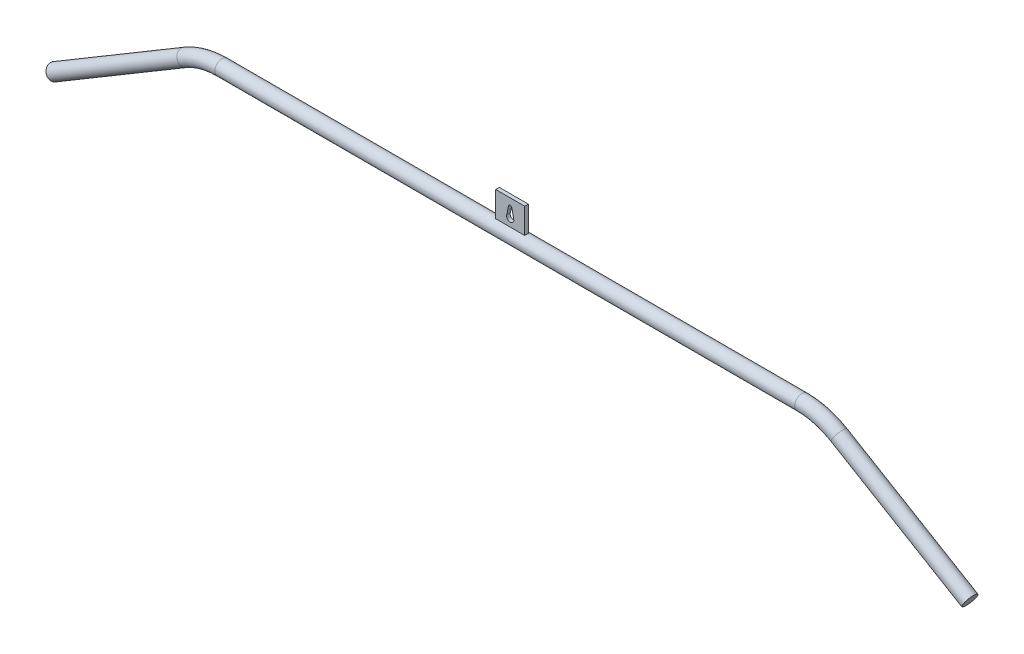
ISO-10303-21;
HEADER;
FILE_DESCRIPTION(('STEP AP214'),'2;1');
FILE_NAME('part.step','',(''),(''),'','','');
FILE_SCHEMA(('AUTOMOTIVE_DESIGN { 1 0 10303 214 1 1 1 1 }'));
ENDSEC;
DATA;
#1=APPLICATION_CONTEXT('core data for automotive mechanical design processes');
#2=APPLICATION_PROTOCOL_DEFINITION('international standard','automotive_design',2000,#1);
#3=PRODUCT_CONTEXT('',#1,'mechanical');
#4=PRODUCT('Part','Part','',(#3));
#5=PRODUCT_RELATED_PRODUCT_CATEGORY('part','',(#4));
#6=PRODUCT_DEFINITION_FORMATION('','',#4);
#7=PRODUCT_DEFINITION_CONTEXT('part definition',#1,'design');
#8=PRODUCT_DEFINITION('design','',#6,#7);
#9=PRODUCT_DEFINITION_SHAPE('','',#8);
#10=(LENGTH_UNIT() NAMED_UNIT(*) SI_UNIT(.MILLI.,.METRE.));
#11=(NAMED_UNIT(*) PLANE_ANGLE_UNIT() SI_UNIT($,.RADIAN.));
#12=(NAMED_UNIT(*) SI_UNIT($,.STERADIAN.) SOLID_ANGLE_UNIT());
#13=UNCERTAINTY_MEASURE_WITH_UNIT(LENGTH_MEASURE(1.E-05),#10,'distance_accuracy_value','');
#14=(GEOMETRIC_REPRESENTATION_CONTEXT(3) GLOBAL_UNCERTAINTY_ASSIGNED_CONTEXT((#13)) GLOBAL_UNIT_ASSIGNED_CONTEXT((#10,
#11,#12)) REPRESENTATION_CONTEXT('',''));
#15=CARTESIAN_POINT('',(0.,0.,0.));
#16=DIRECTION('',(0.,0.,1.));
#17=DIRECTION('',(1.,0.,0.));
#18=AXIS2_PLACEMENT_3D('',#15,#16,#17);
#19=CARTESIAN_POINT('',(20.,0.,2.5));
#20=DIRECTION('',(1.,0.,0.));
#21=DIRECTION('',(0.,1.,0.));
#22=AXIS2_PLACEMENT_3D('',#19,#20,#21);
#23=PLANE('',#22);
#24=DIRECTION('',(0.,-1.,0.));
#25=VECTOR('',#24,1.);
#26=CARTESIAN_POINT('',(20.,0.,-2.5));
#27=LINE('',#26,#25);
#28=CARTESIAN_POINT('',(20.,46.5438393839384,-2.5));
#29=VERTEX_POINT('',#28);
#30=CARTESIAN_POINT('',(20.,11.5438393839384,-2.5));
#31=VERTEX_POINT('',#30);
#32=EDGE_CURVE('E163',#29,#31,#27,.T.);
#33=ORIENTED_EDGE('',*,*,#32,.F.);
#34=DIRECTION('',(0.,0.,-1.));
#35=VECTOR('',#34,1.);
#36=CARTESIAN_POINT('',(20.,46.5438393839384,2.5));
#37=LINE('',#36,#35);
#38=CARTESIAN_POINT('',(20.,46.5438393839384,2.5));
#39=VERTEX_POINT('',#38);
#40=EDGE_CURVE('E12',#39,#29,#37,.T.);
#41=ORIENTED_EDGE('',*,*,#40,.F.);
#42=DIRECTION('',(0.,-1.,0.));
#43=VECTOR('',#42,1.);
#44=CARTESIAN_POINT('',(20.,0.,2.5));
#45=LINE('',#44,#43);
#46=CARTESIAN_POINT('',(20.,11.5438393839384,2.5));
#47=VERTEX_POINT('',#46);
#48=EDGE_CURVE('E136',#39,#47,#45,.T.);
#49=ORIENTED_EDGE('',*,*,#48,.T.);
#50=DIRECTION('',(0.,0.,-1.));
#51=VECTOR('',#50,1.);
#52=CARTESIAN_POINT('',(20.,11.5438393839384,2.5));
#53=LINE('',#52,#51);
#54=EDGE_CURVE('E102',#47,#31,#53,.T.);
#55=ORIENTED_EDGE('',*,*,#54,.T.);
#56=EDGE_LOOP('',(#33,#41,#49,#55));
#57=FACE_BOUND('',#56,.T.);
#58=ADVANCED_FACE('F49',(#57),#23,.T.);
#59=CARTESIAN_POINT('',(0.,46.5438393839385,2.5));
#60=DIRECTION('',(0.,-1.,0.));
#61=DIRECTION('',(1.,0.,0.));
#62=AXIS2_PLACEMENT_3D('',#59,#60,#61);
#63=PLANE('',#62);
#64=DIRECTION('',(-1.,0.,0.));
#65=VECTOR('',#64,1.);
#66=CARTESIAN_POINT('',(0.,46.5438393839385,-2.5));
#67=LINE('',#66,#65);
#68=CARTESIAN_POINT('',(-20.,46.5438393839385,-2.5));
#69=VERTEX_POINT('',#68);
#70=EDGE_CURVE('E141',#29,#69,#67,.T.);
#71=ORIENTED_EDGE('',*,*,#70,.T.);
#72=DIRECTION('',(0.,0.,-1.));
#73=VECTOR('',#72,1.);
#74=CARTESIAN_POINT('',(-20.,46.5438393839385,2.5));
#75=LINE('',#74,#73);
#76=CARTESIAN_POINT('',(-20.,46.5438393839385,2.5));
#77=VERTEX_POINT('',#76);
#78=EDGE_CURVE('E59',#77,#69,#75,.T.);
#79=ORIENTED_EDGE('',*,*,#78,.F.);
#80=DIRECTION('',(-1.,0.,0.));
#81=VECTOR('',#80,1.);
#82=CARTESIAN_POINT('',(0.,46.5438393839385,2.5));
#83=LINE('',#82,#81);
#84=EDGE_CURVE('E132',#39,#77,#83,.T.);
#85=ORIENTED_EDGE('',*,*,#84,.F.);
#86=ORIENTED_EDGE('',*,*,#40,.T.);
#87=EDGE_LOOP('',(#71,#79,#85,#86));
#88=FACE_BOUND('',#87,.T.);
#89=ADVANCED_FACE('F139',(#88),#63,.F.);
#90=CARTESIAN_POINT('',(-20.,0.,2.5));
#91=DIRECTION('',(1.,0.,0.));
#92=DIRECTION('',(0.,1.,0.));
#93=AXIS2_PLACEMENT_3D('',#90,#91,#92);
#94=PLANE('',#93);
#95=DIRECTION('',(0.,-1.,0.));
#96=VECTOR('',#95,1.);
#97=CARTESIAN_POINT('',(-20.,0.,-2.5));
#98=LINE('',#97,#96);
#99=CARTESIAN_POINT('',(-20.,11.5438393839384,-2.5));
#100=VERTEX_POINT('',#99);
#101=EDGE_CURVE('E160',#69,#100,#98,.T.);
#102=ORIENTED_EDGE('',*,*,#101,.T.);
#103=DIRECTION('',(0.,0.,-1.));
#104=VECTOR('',#103,1.);
#105=CARTESIAN_POINT('',(-20.,11.5438393839384,2.5));
#106=LINE('',#105,#104);
#107=CARTESIAN_POINT('',(-20.,11.5438393839384,2.5));
#108=VERTEX_POINT('',#107);
#109=EDGE_CURVE('E131',#108,#100,#106,.T.);
#110=ORIENTED_EDGE('',*,*,#109,.F.);
#111=DIRECTION('',(0.,-1.,0.));
#112=VECTOR('',#111,1.);
#113=CARTESIAN_POINT('',(-20.,0.,2.5));
#114=LINE('',#113,#112);
#115=EDGE_CURVE('E125',#77,#108,#114,.T.);
#116=ORIENTED_EDGE('',*,*,#115,.F.);
#117=ORIENTED_EDGE('',*,*,#78,.T.);
#118=EDGE_LOOP('',(#102,#110,#116,#117));
#119=FACE_BOUND('',#118,.T.);
#120=ADVANCED_FACE('F128',(#119),#94,.F.);
#121=CARTESIAN_POINT('',(0.,34.9500495291007,2.5));
#122=DIRECTION('',(0.,0.,-1.));
#123=DIRECTION('',(-1.,0.,0.));
#124=AXIS2_PLACEMENT_3D('',#121,#122,#123);
#125=CYLINDRICAL_SURFACE('',#124,2.52047407169072);
#126=CARTESIAN_POINT('',(0.,34.9500495291007,-2.5));
#127=DIRECTION('',(0.,0.,1.));
#128=DIRECTION('',(1.,0.,0.));
#129=AXIS2_PLACEMENT_3D('',#126,#127,#128);
#130=CIRCLE('',#129,2.52047407169072);
#131=CARTESIAN_POINT('',(2.52047407169072,34.9500495291007,-2.5));
#132=VERTEX_POINT('',#131);
#133=CARTESIAN_POINT('',(-2.52047407169072,34.9500495291007,-2.5));
#134=VERTEX_POINT('',#133);
#135=EDGE_CURVE('E173',#132,#134,#130,.T.);
#136=ORIENTED_EDGE('',*,*,#135,.F.);
#137=DIRECTION('',(0.,0.,-1.));
#138=VECTOR('',#137,1.);
#139=CARTESIAN_POINT('',(2.52047407169072,34.9500495291007,2.5));
#140=LINE('',#139,#138);
#141=CARTESIAN_POINT('',(2.52047407169072,34.9500495291007,2.5));
#142=VERTEX_POINT('',#141);
#143=EDGE_CURVE('E53',#142,#132,#140,.T.);
#144=ORIENTED_EDGE('',*,*,#143,.F.);
#145=CARTESIAN_POINT('',(0.,34.9500495291007,2.5));
#146=DIRECTION('',(0.,0.,1.));
#147=DIRECTION('',(1.,0.,0.));
#148=AXIS2_PLACEMENT_3D('',#145,#146,#147);
#149=CIRCLE('',#148,2.52047407169072);
#150=CARTESIAN_POINT('',(-2.52047407169072,34.9500495291007,2.5));
#151=VERTEX_POINT('',#150);
#152=EDGE_CURVE('E159',#142,#151,#149,.T.);
#153=ORIENTED_EDGE('',*,*,#152,.T.);
#154=DIRECTION('',(0.,0.,-1.));
#155=VECTOR('',#154,1.);
#156=CARTESIAN_POINT('',(-2.52047407169072,34.9500495291007,2.5));
#157=LINE('',#156,#155);
#158=EDGE_CURVE('E146',#151,#134,#157,.T.);
#159=ORIENTED_EDGE('',*,*,#158,.T.);
#160=EDGE_LOOP('',(#136,#144,#153,#159));
#161=FACE_BOUND('',#160,.T.);
#162=ADVANCED_FACE('F51',(#161),#125,.F.);
#163=CARTESIAN_POINT('',(9.08940393943057,1.80119838092691,2.5));
#164=DIRECTION('',(0.980925370648749,0.194384714464934,0.));
#165=DIRECTION('',(-0.194384714464934,0.980925370648749,0.));
#166=AXIS2_PLACEMENT_3D('',#163,#164,#165);
#167=PLANE('',#166);
#168=DIRECTION('',(0.194384714464934,-0.980925370648749,0.));
#169=VECTOR('',#168,1.);
#170=CARTESIAN_POINT('',(9.08940393943057,1.80119838092691,-2.5));
#171=LINE('',#170,#169);
#172=CARTESIAN_POINT('',(4.61986430306202,24.3558773149282,-2.5));
#173=VERTEX_POINT('',#172);
#174=EDGE_CURVE('E171',#132,#173,#171,.T.);
#175=ORIENTED_EDGE('',*,*,#174,.T.);
#176=DIRECTION('',(0.,0.,-1.));
#177=VECTOR('',#176,1.);
#178=CARTESIAN_POINT('',(4.61986430306202,24.3558773149282,2.5));
#179=LINE('',#178,#177);
#180=CARTESIAN_POINT('',(4.61986430306202,24.3558773149282,2.5));
#181=VERTEX_POINT('',#180);
#182=EDGE_CURVE('E149',#181,#173,#179,.T.);
#183=ORIENTED_EDGE('',*,*,#182,.F.);
#184=DIRECTION('',(0.194384714464934,-0.980925370648749,0.));
#185=VECTOR('',#184,1.);
#186=CARTESIAN_POINT('',(9.08940393943057,1.80119838092691,2.5));
#187=LINE('',#186,#185);
#188=EDGE_CURVE('E182',#142,#181,#187,.T.);
#189=ORIENTED_EDGE('',*,*,#188,.F.);
#190=ORIENTED_EDGE('',*,*,#143,.T.);
#191=EDGE_LOOP('',(#175,#183,#189,#190));
#192=FACE_BOUND('',#191,.T.);
#193=ADVANCED_FACE('F194',(#192),#167,.F.);
#194=CARTESIAN_POINT('',(0.,22.4500495291007,2.5));
#195=DIRECTION('',(0.,0.,-1.));
#196=DIRECTION('',(-1.,0.,0.));
#197=AXIS2_PLACEMENT_3D('',#194,#195,#196);
#198=CYLINDRICAL_SURFACE('',#197,4.99753196367356);
#199=CARTESIAN_POINT('',(0.,22.4500495291007,-2.5));
#200=DIRECTION('',(0.,0.,1.));
#201=DIRECTION('',(1.,0.,0.));
#202=AXIS2_PLACEMENT_3D('',#199,#200,#201);
#203=CIRCLE('',#202,4.99753196367356);
#204=CARTESIAN_POINT('',(-4.61986430306202,24.3558773149282,-2.5));
#205=VERTEX_POINT('',#204);
#206=EDGE_CURVE('E168',#205,#173,#203,.T.);
#207=ORIENTED_EDGE('',*,*,#206,.F.);
#208=DIRECTION('',(0.,0.,-1.));
#209=VECTOR('',#208,1.);
#210=CARTESIAN_POINT('',(-4.61986430306202,24.3558773149282,2.5));
#211=LINE('',#210,#209);
#212=CARTESIAN_POINT('',(-4.61986430306202,24.3558773149282,2.5));
#213=VERTEX_POINT('',#212);
#214=EDGE_CURVE('E148',#213,#205,#211,.T.);
#215=ORIENTED_EDGE('',*,*,#214,.F.);
#216=CARTESIAN_POINT('',(0.,22.4500495291007,2.5));
#217=DIRECTION('',(0.,0.,1.));
#218=DIRECTION('',(1.,0.,0.));
#219=AXIS2_PLACEMENT_3D('',#216,#217,#218);
#220=CIRCLE('',#219,4.99753196367356);
#221=EDGE_CURVE('E180',#213,#181,#220,.T.);
#222=ORIENTED_EDGE('',*,*,#221,.T.);
#223=ORIENTED_EDGE('',*,*,#182,.T.);
#224=EDGE_LOOP('',(#207,#215,#222,#223));
#225=FACE_BOUND('',#224,.T.);
#226=ADVANCED_FACE('F195',(#225),#198,.F.);
#227=CARTESIAN_POINT('',(-9.08940393943058,1.80119838092691,2.5));
#228=DIRECTION('',(-0.980925370648749,0.194384714464934,0.));
#229=DIRECTION('',(-0.194384714464934,-0.980925370648749,0.));
#230=AXIS2_PLACEMENT_3D('',#227,#228,#229);
#231=PLANE('',#230);
#232=DIRECTION('',(0.194384714464934,0.980925370648749,0.));
#233=VECTOR('',#232,1.);
#234=CARTESIAN_POINT('',(-9.08940393943058,1.80119838092691,-2.5));
#235=LINE('',#234,#233);
#236=EDGE_CURVE('E165',#205,#134,#235,.T.);
#237=ORIENTED_EDGE('',*,*,#236,.T.);
#238=ORIENTED_EDGE('',*,*,#158,.F.);
#239=DIRECTION('',(0.194384714464934,0.980925370648749,0.));
#240=VECTOR('',#239,1.);
#241=CARTESIAN_POINT('',(-9.08940393943058,1.80119838092691,2.5));
#242=LINE('',#241,#240);
#243=EDGE_CURVE('E178',#213,#151,#242,.T.);
#244=ORIENTED_EDGE('',*,*,#243,.F.);
#245=ORIENTED_EDGE('',*,*,#214,.T.);
#246=EDGE_LOOP('',(#237,#238,#244,#245));
#247=FACE_BOUND('',#246,.T.);
#248=ADVANCED_FACE('F190',(#247),#231,.F.);
#249=CARTESIAN_POINT('',(0.,11.5438393839384,2.5));
#250=DIRECTION('',(0.,1.,0.));
#251=DIRECTION('',(-1.,0.,0.));
#252=AXIS2_PLACEMENT_3D('',#249,#250,#251);
#253=PLANE('',#252);
#254=DIRECTION('',(1.,0.,0.));
#255=VECTOR('',#254,1.);
#256=CARTESIAN_POINT('',(0.,11.5438393839384,-2.5));
#257=LINE('',#256,#255);
#258=EDGE_CURVE('E95',#100,#31,#257,.T.);
#259=ORIENTED_EDGE('',*,*,#258,.T.);
#260=ORIENTED_EDGE('',*,*,#54,.F.);
#261=DIRECTION('',(1.,0.,0.));
#262=VECTOR('',#261,1.);
#263=CARTESIAN_POINT('',(0.,11.5438393839384,2.5));
#264=LINE('',#263,#262);
#265=EDGE_CURVE('E68',#108,#47,#264,.T.);
#266=ORIENTED_EDGE('',*,*,#265,.F.);
#267=ORIENTED_EDGE('',*,*,#109,.T.);
#268=EDGE_LOOP('',(#259,#260,#266,#267));
#269=FACE_BOUND('',#268,.T.);
#270=ADVANCED_FACE('F202',(#269),#253,.F.);
#271=CARTESIAN_POINT('',(0.,0.,2.5));
#272=DIRECTION('',(0.,0.,1.));
#273=DIRECTION('',(1.,0.,0.));
#274=AXIS2_PLACEMENT_3D('',#271,#272,#273);
#275=PLANE('',#274);
#276=ORIENTED_EDGE('',*,*,#152,.F.);
#277=ORIENTED_EDGE('',*,*,#188,.T.);
#278=ORIENTED_EDGE('',*,*,#221,.F.);
#279=ORIENTED_EDGE('',*,*,#243,.T.);
#280=EDGE_LOOP('',(#276,#277,#278,#279));
#281=FACE_BOUND('',#280,.T.);
#282=ORIENTED_EDGE('',*,*,#48,.F.);
#283=ORIENTED_EDGE('',*,*,#84,.T.);
#284=ORIENTED_EDGE('',*,*,#115,.T.);
#285=ORIENTED_EDGE('',*,*,#265,.T.);
#286=EDGE_LOOP('',(#282,#283,#284,#285));
#287=FACE_BOUND('',#286,.T.);
#288=ADVANCED_FACE('F135',(#281,#287),#275,.T.);
#289=CARTESIAN_POINT('',(0.,0.,-2.5));
#290=DIRECTION('',(0.,0.,1.));
#291=DIRECTION('',(1.,0.,0.));
#292=AXIS2_PLACEMENT_3D('',#289,#290,#291);
#293=PLANE('',#292);
#294=ORIENTED_EDGE('',*,*,#135,.T.);
#295=ORIENTED_EDGE('',*,*,#236,.F.);
#296=ORIENTED_EDGE('',*,*,#206,.T.);
#297=ORIENTED_EDGE('',*,*,#174,.F.);
#298=EDGE_LOOP('',(#294,#295,#296,#297));
#299=FACE_BOUND('',#298,.T.);
#300=ORIENTED_EDGE('',*,*,#32,.T.);
#301=ORIENTED_EDGE('',*,*,#258,.F.);
#302=ORIENTED_EDGE('',*,*,#101,.F.);
#303=ORIENTED_EDGE('',*,*,#70,.F.);
#304=EDGE_LOOP('',(#300,#301,#302,#303));
#305=FACE_BOUND('',#304,.T.);
#306=ADVANCED_FACE('F193',(#299,#305),#293,.F.);
#307=CLOSED_SHELL('',(#58,#89,#120,#162,#193,#226,#248,#270,#288,#306));
#308=MANIFOLD_SOLID_BREP('B2',#307);
#309=CARTESIAN_POINT('',(631.598628230874,-119.952099804136,0.));
#310=DIRECTION('',(0.859262809790686,-0.5115343817483,0.));
#311=DIRECTION('',(0.,0.,-1.));
#312=AXIS2_PLACEMENT_3D('',#309,#310,#311);
#313=PLANE('',#312);
#314=CARTESIAN_POINT('',(631.598628230874,-119.952099804136,0.));
#315=DIRECTION('',(0.859262809790686,-0.5115343817483,0.));
#316=DIRECTION('',(0.,0.,-1.));
#317=AXIS2_PLACEMENT_3D('',#314,#315,#316);
#318=CIRCLE('',#317,10.);
#319=CARTESIAN_POINT('',(631.598628230874,-119.952099804136,-10.));
#320=VERTEX_POINT('',#319);
#321=EDGE_CURVE('E48',#320,#320,#318,.T.);
#322=ORIENTED_EDGE('',*,*,#321,.T.);
#323=EDGE_LOOP('',(#322));
#324=FACE_BOUND('',#323,.T.);
#325=ADVANCED_FACE('F279',(#324),#313,.T.);
#326=CARTESIAN_POINT('',(0.,1.5438393839384,0.));
#327=DIRECTION('',(1.,0.,0.));
#328=DIRECTION('',(0.,1.,0.));
#329=AXIS2_PLACEMENT_3D('',#326,#327,#328);
#330=CYLINDRICAL_SURFACE('',#329,10.);
#331=CARTESIAN_POINT('',(400.,1.5438393839384,0.));
#332=DIRECTION('',(1.,0.,0.));
#333=DIRECTION('',(0.,0.,-1.));
#334=AXIS2_PLACEMENT_3D('',#331,#332,#333);
#335=CIRCLE('',#334,10.);
#336=CARTESIAN_POINT('',(400.,11.5438393839384,0.));
#337=VERTEX_POINT('',#336);
#338=EDGE_CURVE('E289',#337,#337,#335,.T.);
#339=ORIENTED_EDGE('',*,*,#338,.F.);
#340=EDGE_LOOP('',(#339));
#341=FACE_BOUND('',#340,.T.);
#342=CARTESIAN_POINT('',(-400.,1.5438393839384,0.));
#343=DIRECTION('',(1.,0.,0.));
#344=DIRECTION('',(0.,0.,-1.));
#345=AXIS2_PLACEMENT_3D('',#342,#343,#344);
#346=CIRCLE('',#345,10.);
#347=CARTESIAN_POINT('',(-400.,11.5438393839384,0.));
#348=VERTEX_POINT('',#347);
#349=EDGE_CURVE('E301',#348,#348,#346,.T.);
#350=ORIENTED_EDGE('',*,*,#349,.T.);
#351=EDGE_LOOP('',(#350));
#352=FACE_BOUND('',#351,.T.);
#353=ADVANCED_FACE('F305',(#341,#352),#330,.T.);
#354=CARTESIAN_POINT('',(400.,-98.4561606160616,0.));
#355=DIRECTION('',(0.,0.,-1.));
#356=DIRECTION('',(-1.,0.,0.));
#357=AXIS2_PLACEMENT_3D('',#354,#355,#356);
#358=TOROIDAL_SURFACE('',#357,100.,10.);
#359=CARTESIAN_POINT('',(451.15343817483,-12.529879636993,0.));
#360=DIRECTION('',(0.859262809790686,-0.5115343817483,0.));
#361=DIRECTION('',(0.,0.,-1.));
#362=AXIS2_PLACEMENT_3D('',#359,#360,#361);
#363=CIRCLE('',#362,10.);
#364=CARTESIAN_POINT('',(456.268781992313,-3.93725153908611,0.));
#365=VERTEX_POINT('',#364);
#366=EDGE_CURVE('E285',#365,#365,#363,.T.);
#367=CARTESIAN_POINT('',(400.,-98.4561606160616,0.));
#368=DIRECTION('',(0.,0.,-1.));
#369=DIRECTION('',(-1.,0.,0.));
#370=AXIS2_PLACEMENT_3D('',#367,#368,#369);
#371=CIRCLE('',#370,110.);
#372=EDGE_CURVE('',#337,#365,#371,.T.);
#373=ORIENTED_EDGE('',*,*,#338,.T.);
#374=ORIENTED_EDGE('',*,*,#366,.F.);
#375=ORIENTED_EDGE('',*,*,#372,.T.);
#376=ORIENTED_EDGE('',*,*,#372,.F.);
#377=EDGE_LOOP('',(#373,#375,#374,#376));
#378=FACE_BOUND('',#377,.T.);
#379=ADVANCED_FACE('F323',(#378),#358,.T.);
#380=CARTESIAN_POINT('',(451.15343817483,-12.529879636993,0.));
#381=DIRECTION('',(0.859262809790686,-0.5115343817483,0.));
#382=DIRECTION('',(0.5115343817483,0.859262809790686,0.));
#383=AXIS2_PLACEMENT_3D('',#380,#381,#382);
#384=CYLINDRICAL_SURFACE('',#383,10.);
#385=ORIENTED_EDGE('',*,*,#321,.F.);
#386=EDGE_LOOP('',(#385));
#387=FACE_BOUND('',#386,.T.);
#388=ORIENTED_EDGE('',*,*,#366,.T.);
#389=EDGE_LOOP('',(#388));
#390=FACE_BOUND('',#389,.T.);
#391=ADVANCED_FACE('F319',(#387,#390),#384,.T.);
#392=CARTESIAN_POINT('',(-631.598628230874,-119.952099804136,0.));
#393=DIRECTION('',(-0.859262809790686,-0.5115343817483,0.));
#394=DIRECTION('',(0.,0.,-1.));
#395=AXIS2_PLACEMENT_3D('',#392,#393,#394);
#396=PLANE('',#395);
#397=CARTESIAN_POINT('',(-631.598628230874,-119.952099804136,0.));
#398=DIRECTION('',(0.859262809790686,0.5115343817483,0.));
#399=DIRECTION('',(0.,0.,-1.));
#400=AXIS2_PLACEMENT_3D('',#397,#398,#399);
#401=CIRCLE('',#400,10.);
#402=CARTESIAN_POINT('',(-631.598628230874,-119.952099804136,-10.));
#403=VERTEX_POINT('',#402);
#404=EDGE_CURVE('E293',#403,#403,#401,.T.);
#405=ORIENTED_EDGE('',*,*,#404,.F.);
#406=EDGE_LOOP('',(#405));
#407=FACE_BOUND('',#406,.T.);
#408=ADVANCED_FACE('F310',(#407),#396,.T.);
#409=CARTESIAN_POINT('',(-400.,-98.4561606160616,0.));
#410=DIRECTION('',(0.,0.,-1.));
#411=DIRECTION('',(1.,0.,0.));
#412=AXIS2_PLACEMENT_3D('',#409,#410,#411);
#413=TOROIDAL_SURFACE('',#412,100.,10.);
#414=CARTESIAN_POINT('',(-451.15343817483,-12.529879636993,0.));
#415=DIRECTION('',(0.859262809790686,0.5115343817483,0.));
#416=DIRECTION('',(0.,0.,-1.));
#417=AXIS2_PLACEMENT_3D('',#414,#415,#416);
#418=CIRCLE('',#417,10.);
#419=CARTESIAN_POINT('',(-456.268781992313,-3.93725153908611,0.));
#420=VERTEX_POINT('',#419);
#421=EDGE_CURVE('E298',#420,#420,#418,.T.);
#422=CARTESIAN_POINT('',(-400.,-98.4561606160616,0.));
#423=DIRECTION('',(0.,0.,-1.));
#424=DIRECTION('',(1.,0.,0.));
#425=AXIS2_PLACEMENT_3D('',#422,#423,#424);
#426=CIRCLE('',#425,110.);
#427=EDGE_CURVE('',#420,#348,#426,.T.);
#428=ORIENTED_EDGE('',*,*,#421,.T.);
#429=ORIENTED_EDGE('',*,*,#349,.F.);
#430=ORIENTED_EDGE('',*,*,#427,.T.);
#431=ORIENTED_EDGE('',*,*,#427,.F.);
#432=EDGE_LOOP('',(#428,#430,#429,#431));
#433=FACE_BOUND('',#432,.T.);
#434=ADVANCED_FACE('F307',(#433),#413,.T.);
#435=CARTESIAN_POINT('',(-451.15343817483,-12.529879636993,0.));
#436=DIRECTION('',(-0.859262809790686,-0.5115343817483,0.));
#437=DIRECTION('',(-0.5115343817483,0.859262809790686,0.));
#438=AXIS2_PLACEMENT_3D('',#435,#436,#437);
#439=CYLINDRICAL_SURFACE('',#438,10.);
#440=ORIENTED_EDGE('',*,*,#404,.T.);
#441=EDGE_LOOP('',(#440));
#442=FACE_BOUND('',#441,.T.);
#443=ORIENTED_EDGE('',*,*,#421,.F.);
#444=EDGE_LOOP('',(#443));
#445=FACE_BOUND('',#444,.T.);
#446=ADVANCED_FACE('F309',(#442,#445),#439,.T.);
#447=CLOSED_SHELL('',(#325,#353,#379,#391,#408,#434,#446));
#448=MANIFOLD_SOLID_BREP('B6',#447);
#449=ADVANCED_BREP_SHAPE_REPRESENTATION('',(#18,#308,#448),#14);
#450=SHAPE_DEFINITION_REPRESENTATION(#9,#449);
ENDSEC;
END-ISO-10303-21;
